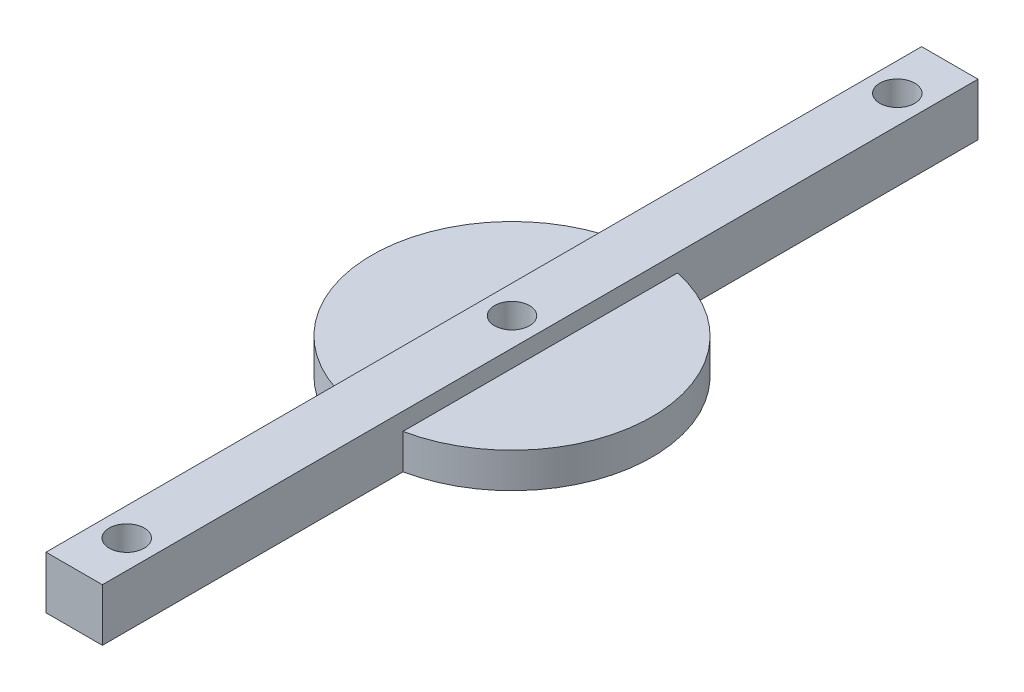
ISO-10303-21;
HEADER;
FILE_DESCRIPTION(('STEP AP214'),'2;1');
FILE_NAME('part.step','',(''),(''),'','','');
FILE_SCHEMA(('AUTOMOTIVE_DESIGN { 1 0 10303 214 1 1 1 1 }'));
ENDSEC;
DATA;
#1=APPLICATION_CONTEXT('core data for automotive mechanical design processes');
#2=APPLICATION_PROTOCOL_DEFINITION('international standard','automotive_design',2000,#1);
#3=PRODUCT_CONTEXT('',#1,'mechanical');
#4=PRODUCT('Part','Part','',(#3));
#5=PRODUCT_RELATED_PRODUCT_CATEGORY('part','',(#4));
#6=PRODUCT_DEFINITION_FORMATION('','',#4);
#7=PRODUCT_DEFINITION_CONTEXT('part definition',#1,'design');
#8=PRODUCT_DEFINITION('design','',#6,#7);
#9=PRODUCT_DEFINITION_SHAPE('','',#8);
#10=(LENGTH_UNIT() NAMED_UNIT(*) SI_UNIT(.MILLI.,.METRE.));
#11=(NAMED_UNIT(*) PLANE_ANGLE_UNIT() SI_UNIT($,.RADIAN.));
#12=(NAMED_UNIT(*) SI_UNIT($,.STERADIAN.) SOLID_ANGLE_UNIT());
#13=UNCERTAINTY_MEASURE_WITH_UNIT(LENGTH_MEASURE(1.E-05),#10,'distance_accuracy_value','');
#14=(GEOMETRIC_REPRESENTATION_CONTEXT(3) GLOBAL_UNCERTAINTY_ASSIGNED_CONTEXT((#13)) GLOBAL_UNIT_ASSIGNED_CONTEXT((#10,
#11,#12)) REPRESENTATION_CONTEXT('',''));
#15=CARTESIAN_POINT('',(0.,0.,0.));
#16=DIRECTION('',(0.,0.,1.));
#17=DIRECTION('',(1.,0.,0.));
#18=AXIS2_PLACEMENT_3D('',#15,#16,#17);
#19=CARTESIAN_POINT('',(8.04956441175495,15.,-125.));
#20=DIRECTION('',(-1.,0.,0.));
#21=DIRECTION('',(0.,0.,1.));
#22=AXIS2_PLACEMENT_3D('',#19,#20,#21);
#23=PLANE('',#22);
#24=DIRECTION('',(0.,-1.,0.));
#25=VECTOR('',#24,1.);
#26=CARTESIAN_POINT('',(8.04956441175496,10.,-39.1816859359192));
#27=LINE('',#26,#25);
#28=CARTESIAN_POINT('',(8.04956441175496,0.,-39.1816859359192));
#29=VERTEX_POINT('',#28);
#30=CARTESIAN_POINT('',(8.04956441175496,10.,-39.1816859359192));
#31=VERTEX_POINT('',#30);
#32=EDGE_CURVE('E114',#29,#31,#27,.F.);
#33=ORIENTED_EDGE('',*,*,#32,.F.);
#34=DIRECTION('',(0.,0.,-1.));
#35=VECTOR('',#34,1.);
#36=CARTESIAN_POINT('',(8.04956441175495,0.,-125.));
#37=LINE('',#36,#35);
#38=CARTESIAN_POINT('',(8.04956441175495,0.,-125.));
#39=VERTEX_POINT('',#38);
#40=EDGE_CURVE('E103',#29,#39,#37,.T.);
#41=ORIENTED_EDGE('',*,*,#40,.T.);
#42=DIRECTION('',(0.,-1.,0.));
#43=VECTOR('',#42,1.);
#44=CARTESIAN_POINT('',(8.04956441175495,15.,-125.));
#45=LINE('',#44,#43);
#46=CARTESIAN_POINT('',(8.04956441175495,15.,-125.));
#47=VERTEX_POINT('',#46);
#48=EDGE_CURVE('E47',#47,#39,#45,.T.);
#49=ORIENTED_EDGE('',*,*,#48,.F.);
#50=DIRECTION('',(0.,0.,-1.));
#51=VECTOR('',#50,1.);
#52=CARTESIAN_POINT('',(8.04956441175495,15.,-125.));
#53=LINE('',#52,#51);
#54=CARTESIAN_POINT('',(8.04956441175498,15.,125.));
#55=VERTEX_POINT('',#54);
#56=EDGE_CURVE('E137',#55,#47,#53,.T.);
#57=ORIENTED_EDGE('',*,*,#56,.F.);
#58=DIRECTION('',(0.,-1.,0.));
#59=VECTOR('',#58,1.);
#60=CARTESIAN_POINT('',(8.04956441175498,15.,125.));
#61=LINE('',#60,#59);
#62=CARTESIAN_POINT('',(8.04956441175498,0.,125.));
#63=VERTEX_POINT('',#62);
#64=EDGE_CURVE('E146',#55,#63,#61,.T.);
#65=ORIENTED_EDGE('',*,*,#64,.T.);
#66=CARTESIAN_POINT('',(8.04956441175497,0.,39.1816859359192));
#67=VERTEX_POINT('',#66);
#68=EDGE_CURVE('E112',#63,#67,#37,.T.);
#69=ORIENTED_EDGE('',*,*,#68,.T.);
#70=DIRECTION('',(0.,-1.,0.));
#71=VECTOR('',#70,1.);
#72=CARTESIAN_POINT('',(8.04956441175497,10.,39.1816859359192));
#73=LINE('',#72,#71);
#74=CARTESIAN_POINT('',(8.04956441175497,10.,39.1816859359192));
#75=VERTEX_POINT('',#74);
#76=EDGE_CURVE('E60',#75,#67,#73,.T.);
#77=ORIENTED_EDGE('',*,*,#76,.F.);
#78=DIRECTION('',(0.,0.,-1.));
#79=VECTOR('',#78,1.);
#80=CARTESIAN_POINT('',(8.04956441175495,10.,-125.));
#81=LINE('',#80,#79);
#82=EDGE_CURVE('E55',#75,#31,#81,.T.);
#83=ORIENTED_EDGE('',*,*,#82,.T.);
#84=EDGE_LOOP('',(#33,#41,#49,#57,#65,#69,#77,#83));
#85=FACE_BOUND('',#84,.T.);
#86=ADVANCED_FACE('F39',(#85),#23,.F.);
#87=CARTESIAN_POINT('',(-8.04956441175499,15.,-125.));
#88=DIRECTION('',(1.,0.,0.));
#89=DIRECTION('',(0.,0.,-1.));
#90=AXIS2_PLACEMENT_3D('',#87,#88,#89);
#91=PLANE('',#90);
#92=DIRECTION('',(0.,-1.,0.));
#93=VECTOR('',#92,1.);
#94=CARTESIAN_POINT('',(-8.04956441175497,10.,39.1816859359192));
#95=LINE('',#94,#93);
#96=CARTESIAN_POINT('',(-8.04956441175497,0.,39.1816859359192));
#97=VERTEX_POINT('',#96);
#98=CARTESIAN_POINT('',(-8.04956441175497,10.,39.1816859359192));
#99=VERTEX_POINT('',#98);
#100=EDGE_CURVE('E132',#97,#99,#95,.F.);
#101=ORIENTED_EDGE('',*,*,#100,.F.);
#102=DIRECTION('',(0.,0.,1.));
#103=VECTOR('',#102,1.);
#104=CARTESIAN_POINT('',(-8.04956441175499,0.,-125.));
#105=LINE('',#104,#103);
#106=CARTESIAN_POINT('',(-8.04956441175496,0.,125.));
#107=VERTEX_POINT('',#106);
#108=EDGE_CURVE('E149',#97,#107,#105,.T.);
#109=ORIENTED_EDGE('',*,*,#108,.T.);
#110=DIRECTION('',(0.,-1.,0.));
#111=VECTOR('',#110,1.);
#112=CARTESIAN_POINT('',(-8.04956441175496,15.,125.));
#113=LINE('',#112,#111);
#114=CARTESIAN_POINT('',(-8.04956441175496,15.,125.));
#115=VERTEX_POINT('',#114);
#116=EDGE_CURVE('E155',#115,#107,#113,.T.);
#117=ORIENTED_EDGE('',*,*,#116,.F.);
#118=DIRECTION('',(0.,0.,1.));
#119=VECTOR('',#118,1.);
#120=CARTESIAN_POINT('',(-8.04956441175499,15.,-125.));
#121=LINE('',#120,#119);
#122=CARTESIAN_POINT('',(-8.04956441175499,15.,-125.));
#123=VERTEX_POINT('',#122);
#124=EDGE_CURVE('E143',#123,#115,#121,.T.);
#125=ORIENTED_EDGE('',*,*,#124,.F.);
#126=DIRECTION('',(0.,-1.,0.));
#127=VECTOR('',#126,1.);
#128=CARTESIAN_POINT('',(-8.04956441175499,15.,-125.));
#129=LINE('',#128,#127);
#130=CARTESIAN_POINT('',(-8.04956441175499,0.,-125.));
#131=VERTEX_POINT('',#130);
#132=EDGE_CURVE('E158',#123,#131,#129,.T.);
#133=ORIENTED_EDGE('',*,*,#132,.T.);
#134=CARTESIAN_POINT('',(-8.04956441175498,0.,-39.1816859359192));
#135=VERTEX_POINT('',#134);
#136=EDGE_CURVE('E150',#131,#135,#105,.T.);
#137=ORIENTED_EDGE('',*,*,#136,.T.);
#138=DIRECTION('',(0.,-1.,0.));
#139=VECTOR('',#138,1.);
#140=CARTESIAN_POINT('',(-8.04956441175498,10.,-39.1816859359192));
#141=LINE('',#140,#139);
#142=CARTESIAN_POINT('',(-8.04956441175498,10.,-39.1816859359192));
#143=VERTEX_POINT('',#142);
#144=EDGE_CURVE('E129',#143,#135,#141,.T.);
#145=ORIENTED_EDGE('',*,*,#144,.F.);
#146=DIRECTION('',(0.,0.,1.));
#147=VECTOR('',#146,1.);
#148=CARTESIAN_POINT('',(-8.04956441175499,10.,-125.));
#149=LINE('',#148,#147);
#150=EDGE_CURVE('E11',#143,#99,#149,.T.);
#151=ORIENTED_EDGE('',*,*,#150,.T.);
#152=EDGE_LOOP('',(#101,#109,#117,#125,#133,#137,#145,#151));
#153=FACE_BOUND('',#152,.T.);
#154=ADVANCED_FACE('F200',(#153),#91,.F.);
#155=CARTESIAN_POINT('',(-8.04956441175499,15.,-125.));
#156=DIRECTION('',(0.,0.,1.));
#157=DIRECTION('',(1.,0.,0.));
#158=AXIS2_PLACEMENT_3D('',#155,#156,#157);
#159=PLANE('',#158);
#160=DIRECTION('',(-1.,0.,0.));
#161=VECTOR('',#160,1.);
#162=CARTESIAN_POINT('',(-8.04956441175499,0.,-125.));
#163=LINE('',#162,#161);
#164=EDGE_CURVE('E109',#39,#131,#163,.T.);
#165=ORIENTED_EDGE('',*,*,#164,.T.);
#166=ORIENTED_EDGE('',*,*,#132,.F.);
#167=DIRECTION('',(-1.,0.,0.));
#168=VECTOR('',#167,1.);
#169=CARTESIAN_POINT('',(-8.04956441175499,15.,-125.));
#170=LINE('',#169,#168);
#171=EDGE_CURVE('E140',#47,#123,#170,.T.);
#172=ORIENTED_EDGE('',*,*,#171,.F.);
#173=ORIENTED_EDGE('',*,*,#48,.T.);
#174=EDGE_LOOP('',(#165,#166,#172,#173));
#175=FACE_BOUND('',#174,.T.);
#176=ADVANCED_FACE('F205',(#175),#159,.F.);
#177=CARTESIAN_POINT('',(-8.04956441175496,15.,125.));
#178=DIRECTION('',(0.,0.,-1.));
#179=DIRECTION('',(-1.,0.,0.));
#180=AXIS2_PLACEMENT_3D('',#177,#178,#179);
#181=PLANE('',#180);
#182=DIRECTION('',(1.,0.,0.));
#183=VECTOR('',#182,1.);
#184=CARTESIAN_POINT('',(-8.04956441175496,0.,125.));
#185=LINE('',#184,#183);
#186=EDGE_CURVE('E141',#107,#63,#185,.T.);
#187=ORIENTED_EDGE('',*,*,#186,.T.);
#188=ORIENTED_EDGE('',*,*,#64,.F.);
#189=DIRECTION('',(1.,0.,0.));
#190=VECTOR('',#189,1.);
#191=CARTESIAN_POINT('',(-8.04956441175496,15.,125.));
#192=LINE('',#191,#190);
#193=EDGE_CURVE('E145',#115,#55,#192,.T.);
#194=ORIENTED_EDGE('',*,*,#193,.F.);
#195=ORIENTED_EDGE('',*,*,#116,.T.);
#196=EDGE_LOOP('',(#187,#188,#194,#195));
#197=FACE_BOUND('',#196,.T.);
#198=ADVANCED_FACE('F212',(#197),#181,.F.);
#199=CARTESIAN_POINT('',(0.,15.,0.));
#200=DIRECTION('',(0.,1.,0.));
#201=DIRECTION('',(0.,0.,1.));
#202=AXIS2_PLACEMENT_3D('',#199,#200,#201);
#203=PLANE('',#202);
#204=CARTESIAN_POINT('',(0.,15.,-110.));
#205=DIRECTION('',(0.,1.,0.));
#206=DIRECTION('',(0.,0.,1.));
#207=AXIS2_PLACEMENT_3D('',#204,#205,#206);
#208=CIRCLE('',#207,5.);
#209=CARTESIAN_POINT('',(0.,15.,-105.));
#210=VERTEX_POINT('',#209);
#211=EDGE_CURVE('E280',#210,#210,#208,.T.);
#212=ORIENTED_EDGE('',*,*,#211,.F.);
#213=EDGE_LOOP('',(#212));
#214=FACE_BOUND('',#213,.T.);
#215=CARTESIAN_POINT('',(0.,15.,110.));
#216=DIRECTION('',(0.,1.,0.));
#217=DIRECTION('',(0.,0.,-1.));
#218=AXIS2_PLACEMENT_3D('',#215,#216,#217);
#219=CIRCLE('',#218,5.);
#220=CARTESIAN_POINT('',(0.,15.,105.));
#221=VERTEX_POINT('',#220);
#222=EDGE_CURVE('E281',#221,#221,#219,.T.);
#223=ORIENTED_EDGE('',*,*,#222,.F.);
#224=EDGE_LOOP('',(#223));
#225=FACE_BOUND('',#224,.T.);
#226=CARTESIAN_POINT('',(0.,15.,0.));
#227=DIRECTION('',(0.,1.,0.));
#228=DIRECTION('',(0.,0.,1.));
#229=AXIS2_PLACEMENT_3D('',#226,#227,#228);
#230=CIRCLE('',#229,5.);
#231=CARTESIAN_POINT('',(0.,15.,5.));
#232=VERTEX_POINT('',#231);
#233=EDGE_CURVE('E165',#232,#232,#230,.T.);
#234=ORIENTED_EDGE('',*,*,#233,.F.);
#235=EDGE_LOOP('',(#234));
#236=FACE_BOUND('',#235,.T.);
#237=ORIENTED_EDGE('',*,*,#56,.T.);
#238=ORIENTED_EDGE('',*,*,#171,.T.);
#239=ORIENTED_EDGE('',*,*,#124,.T.);
#240=ORIENTED_EDGE('',*,*,#193,.T.);
#241=EDGE_LOOP('',(#237,#238,#239,#240));
#242=FACE_BOUND('',#241,.T.);
#243=ADVANCED_FACE('F177',(#214,#225,#236,#242),#203,.T.);
#244=CARTESIAN_POINT('',(0.,0.,0.));
#245=DIRECTION('',(0.,1.,0.));
#246=DIRECTION('',(0.,0.,1.));
#247=AXIS2_PLACEMENT_3D('',#244,#245,#246);
#248=PLANE('',#247);
#249=CARTESIAN_POINT('',(0.,0.,-110.));
#250=DIRECTION('',(0.,1.,0.));
#251=DIRECTION('',(0.,0.,1.));
#252=AXIS2_PLACEMENT_3D('',#249,#250,#251);
#253=CIRCLE('',#252,5.);
#254=CARTESIAN_POINT('',(0.,0.,-105.));
#255=VERTEX_POINT('',#254);
#256=EDGE_CURVE('E42',#255,#255,#253,.F.);
#257=ORIENTED_EDGE('',*,*,#256,.F.);
#258=EDGE_LOOP('',(#257));
#259=FACE_BOUND('',#258,.T.);
#260=CARTESIAN_POINT('',(0.,0.,110.));
#261=DIRECTION('',(0.,1.,0.));
#262=DIRECTION('',(0.,0.,1.));
#263=AXIS2_PLACEMENT_3D('',#260,#261,#262);
#264=CIRCLE('',#263,5.);
#265=CARTESIAN_POINT('',(0.,0.,115.));
#266=VERTEX_POINT('',#265);
#267=EDGE_CURVE('E164',#266,#266,#264,.F.);
#268=ORIENTED_EDGE('',*,*,#267,.F.);
#269=EDGE_LOOP('',(#268));
#270=FACE_BOUND('',#269,.T.);
#271=CARTESIAN_POINT('',(0.,0.,0.));
#272=DIRECTION('',(0.,1.,0.));
#273=DIRECTION('',(0.,0.,1.));
#274=AXIS2_PLACEMENT_3D('',#271,#272,#273);
#275=CIRCLE('',#274,5.);
#276=CARTESIAN_POINT('',(0.,0.,5.));
#277=VERTEX_POINT('',#276);
#278=EDGE_CURVE('E162',#277,#277,#275,.F.);
#279=ORIENTED_EDGE('',*,*,#278,.F.);
#280=EDGE_LOOP('',(#279));
#281=FACE_BOUND('',#280,.T.);
#282=ORIENTED_EDGE('',*,*,#108,.F.);
#283=CARTESIAN_POINT('',(0.,0.,0.));
#284=DIRECTION('',(0.,1.,0.));
#285=DIRECTION('',(0.,0.,1.));
#286=AXIS2_PLACEMENT_3D('',#283,#284,#285);
#287=CIRCLE('',#286,40.);
#288=EDGE_CURVE('E121',#135,#97,#287,.T.);
#289=ORIENTED_EDGE('',*,*,#288,.F.);
#290=ORIENTED_EDGE('',*,*,#136,.F.);
#291=ORIENTED_EDGE('',*,*,#164,.F.);
#292=ORIENTED_EDGE('',*,*,#40,.F.);
#293=EDGE_CURVE('E107',#67,#29,#287,.T.);
#294=ORIENTED_EDGE('',*,*,#293,.F.);
#295=ORIENTED_EDGE('',*,*,#68,.F.);
#296=ORIENTED_EDGE('',*,*,#186,.F.);
#297=EDGE_LOOP('',(#282,#289,#290,#291,#292,#294,#295,#296));
#298=FACE_BOUND('',#297,.T.);
#299=ADVANCED_FACE('F104',(#259,#270,#281,#298),#248,.F.);
#300=CARTESIAN_POINT('',(0.,10.,0.));
#301=DIRECTION('',(0.,1.,0.));
#302=DIRECTION('',(0.,0.,1.));
#303=AXIS2_PLACEMENT_3D('',#300,#301,#302);
#304=PLANE('',#303);
#305=ORIENTED_EDGE('',*,*,#150,.F.);
#306=CARTESIAN_POINT('',(0.,10.,0.));
#307=DIRECTION('',(0.,1.,0.));
#308=DIRECTION('',(0.,0.,1.));
#309=AXIS2_PLACEMENT_3D('',#306,#307,#308);
#310=CIRCLE('',#309,40.);
#311=EDGE_CURVE('E120',#143,#99,#310,.T.);
#312=ORIENTED_EDGE('',*,*,#311,.T.);
#313=EDGE_LOOP('',(#305,#312));
#314=FACE_BOUND('',#313,.T.);
#315=ADVANCED_FACE('F176',(#314),#304,.T.);
#316=CARTESIAN_POINT('',(0.,10.,0.));
#317=DIRECTION('',(0.,-1.,0.));
#318=DIRECTION('',(0.,0.,-1.));
#319=AXIS2_PLACEMENT_3D('',#316,#317,#318);
#320=CYLINDRICAL_SURFACE('',#319,40.);
#321=ORIENTED_EDGE('',*,*,#288,.T.);
#322=ORIENTED_EDGE('',*,*,#100,.T.);
#323=ORIENTED_EDGE('',*,*,#311,.F.);
#324=ORIENTED_EDGE('',*,*,#144,.T.);
#325=EDGE_LOOP('',(#321,#322,#323,#324));
#326=FACE_BOUND('',#325,.T.);
#327=ADVANCED_FACE('F195',(#326),#320,.T.);
#328=ORIENTED_EDGE('',*,*,#82,.F.);
#329=EDGE_CURVE('E124',#75,#31,#310,.T.);
#330=ORIENTED_EDGE('',*,*,#329,.T.);
#331=EDGE_LOOP('',(#328,#330));
#332=FACE_BOUND('',#331,.T.);
#333=ADVANCED_FACE('F193',(#332),#304,.T.);
#334=ORIENTED_EDGE('',*,*,#293,.T.);
#335=ORIENTED_EDGE('',*,*,#32,.T.);
#336=ORIENTED_EDGE('',*,*,#329,.F.);
#337=ORIENTED_EDGE('',*,*,#76,.T.);
#338=EDGE_LOOP('',(#334,#335,#336,#337));
#339=FACE_BOUND('',#338,.T.);
#340=ADVANCED_FACE('F119',(#339),#320,.T.);
#341=CARTESIAN_POINT('',(0.,15.,0.));
#342=DIRECTION('',(0.,-1.,0.));
#343=DIRECTION('',(0.,0.,-1.));
#344=AXIS2_PLACEMENT_3D('',#341,#342,#343);
#345=CYLINDRICAL_SURFACE('',#344,5.);
#346=ORIENTED_EDGE('',*,*,#233,.T.);
#347=EDGE_LOOP('',(#346));
#348=FACE_BOUND('',#347,.T.);
#349=ORIENTED_EDGE('',*,*,#278,.T.);
#350=EDGE_LOOP('',(#349));
#351=FACE_BOUND('',#350,.T.);
#352=ADVANCED_FACE('F182',(#348,#351),#345,.F.);
#353=CARTESIAN_POINT('',(0.,15.,110.));
#354=DIRECTION('',(0.,-1.,0.));
#355=DIRECTION('',(0.,0.,-1.));
#356=AXIS2_PLACEMENT_3D('',#353,#354,#355);
#357=CYLINDRICAL_SURFACE('',#356,5.);
#358=ORIENTED_EDGE('',*,*,#222,.T.);
#359=EDGE_LOOP('',(#358));
#360=FACE_BOUND('',#359,.T.);
#361=ORIENTED_EDGE('',*,*,#267,.T.);
#362=EDGE_LOOP('',(#361));
#363=FACE_BOUND('',#362,.T.);
#364=ADVANCED_FACE('F184',(#360,#363),#357,.F.);
#365=CARTESIAN_POINT('',(0.,15.,-110.));
#366=DIRECTION('',(0.,-1.,0.));
#367=DIRECTION('',(0.,0.,-1.));
#368=AXIS2_PLACEMENT_3D('',#365,#366,#367);
#369=CYLINDRICAL_SURFACE('',#368,5.);
#370=ORIENTED_EDGE('',*,*,#211,.T.);
#371=EDGE_LOOP('',(#370));
#372=FACE_BOUND('',#371,.T.);
#373=ORIENTED_EDGE('',*,*,#256,.T.);
#374=EDGE_LOOP('',(#373));
#375=FACE_BOUND('',#374,.T.);
#376=ADVANCED_FACE('F172',(#372,#375),#369,.F.);
#377=CLOSED_SHELL('',(#86,#154,#176,#198,#243,#299,#315,#327,#333,#340,#352,#364,#376));
#378=MANIFOLD_SOLID_BREP('B2',#377);
#379=ADVANCED_BREP_SHAPE_REPRESENTATION('',(#18,#378),#14);
#380=SHAPE_DEFINITION_REPRESENTATION(#9,#379);
ENDSEC;
END-ISO-10303-21;
